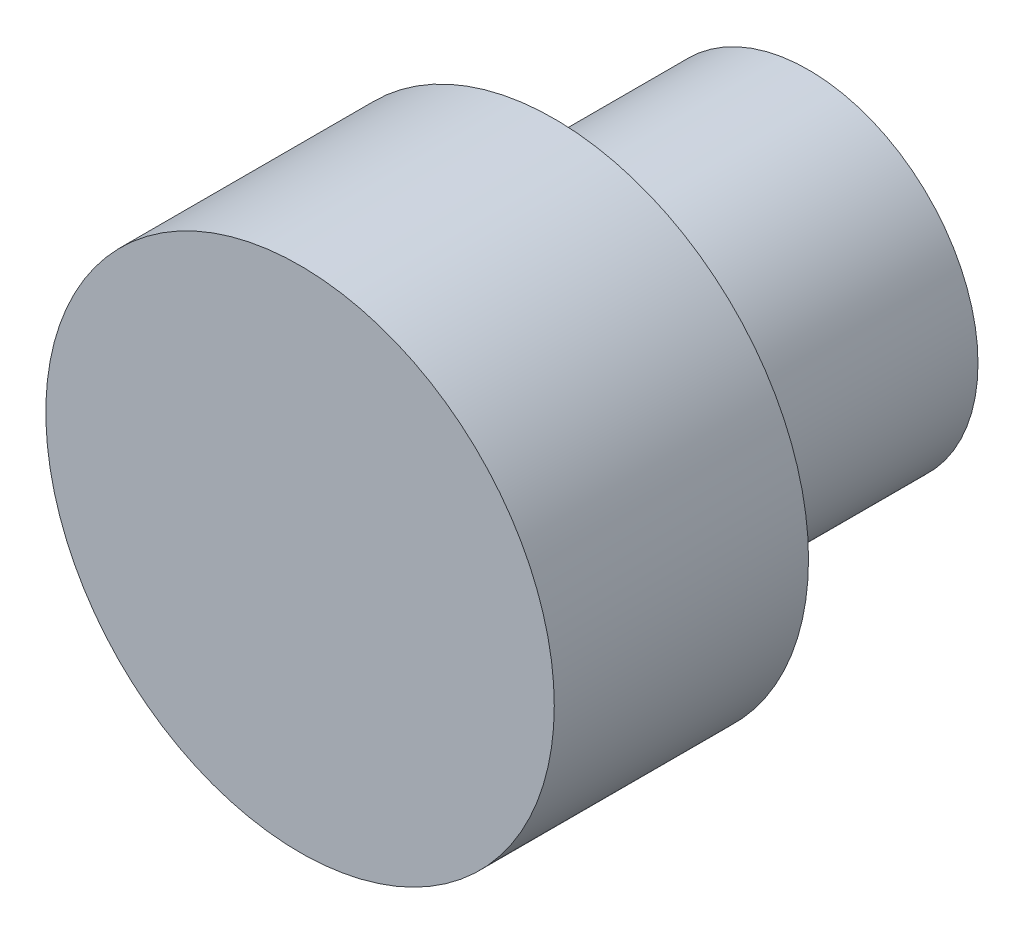
ISO-10303-21;
HEADER;
FILE_DESCRIPTION(('STEP AP214'),'2;1');
FILE_NAME('part.step','',(''),(''),'','','');
FILE_SCHEMA(('AUTOMOTIVE_DESIGN { 1 0 10303 214 1 1 1 1 }'));
ENDSEC;
DATA;
#1=APPLICATION_CONTEXT('core data for automotive mechanical design processes');
#2=APPLICATION_PROTOCOL_DEFINITION('international standard','automotive_design',2000,#1);
#3=PRODUCT_CONTEXT('',#1,'mechanical');
#4=PRODUCT('Part','Part','',(#3));
#5=PRODUCT_RELATED_PRODUCT_CATEGORY('part','',(#4));
#6=PRODUCT_DEFINITION_FORMATION('','',#4);
#7=PRODUCT_DEFINITION_CONTEXT('part definition',#1,'design');
#8=PRODUCT_DEFINITION('design','',#6,#7);
#9=PRODUCT_DEFINITION_SHAPE('','',#8);
#10=(LENGTH_UNIT() NAMED_UNIT(*) SI_UNIT(.MILLI.,.METRE.));
#11=(NAMED_UNIT(*) PLANE_ANGLE_UNIT() SI_UNIT($,.RADIAN.));
#12=(NAMED_UNIT(*) SI_UNIT($,.STERADIAN.) SOLID_ANGLE_UNIT());
#13=UNCERTAINTY_MEASURE_WITH_UNIT(LENGTH_MEASURE(1.E-05),#10,'distance_accuracy_value','');
#14=(GEOMETRIC_REPRESENTATION_CONTEXT(3) GLOBAL_UNCERTAINTY_ASSIGNED_CONTEXT((#13)) GLOBAL_UNIT_ASSIGNED_CONTEXT((#10,
#11,#12)) REPRESENTATION_CONTEXT('',''));
#15=CARTESIAN_POINT('',(0.,0.,0.));
#16=DIRECTION('',(0.,0.,1.));
#17=DIRECTION('',(1.,0.,0.));
#18=AXIS2_PLACEMENT_3D('',#15,#16,#17);
#19=CARTESIAN_POINT('',(0.,3.,0.));
#20=DIRECTION('',(0.,0.,-1.));
#21=DIRECTION('',(-1.,0.,0.));
#22=AXIS2_PLACEMENT_3D('',#19,#20,#21);
#23=PLANE('',#22);
#24=CARTESIAN_POINT('',(0.,0.,0.));
#25=DIRECTION('',(0.,0.,1.));
#26=DIRECTION('',(1.,0.,0.));
#27=AXIS2_PLACEMENT_3D('',#24,#25,#26);
#28=CIRCLE('',#27,3.);
#29=CARTESIAN_POINT('',(3.,0.,0.));
#30=VERTEX_POINT('',#29);
#31=EDGE_CURVE('E46',#30,#30,#28,.T.);
#32=ORIENTED_EDGE('',*,*,#31,.T.);
#33=EDGE_LOOP('',(#32));
#34=FACE_BOUND('',#33,.T.);
#35=ADVANCED_FACE('F32',(#34),#23,.F.);
#36=CARTESIAN_POINT('',(0.,0.,-6.));
#37=DIRECTION('',(0.,0.,1.));
#38=DIRECTION('',(1.,0.,0.));
#39=AXIS2_PLACEMENT_3D('',#36,#37,#38);
#40=PLANE('',#39);
#41=CARTESIAN_POINT('',(0.,0.,-6.));
#42=DIRECTION('',(0.,0.,1.));
#43=DIRECTION('',(1.,0.,0.));
#44=AXIS2_PLACEMENT_3D('',#41,#42,#43);
#45=CIRCLE('',#44,2.);
#46=CARTESIAN_POINT('',(2.,0.,-6.));
#47=VERTEX_POINT('',#46);
#48=EDGE_CURVE('E10',#47,#47,#45,.T.);
#49=ORIENTED_EDGE('',*,*,#48,.F.);
#50=EDGE_LOOP('',(#49));
#51=FACE_BOUND('',#50,.T.);
#52=ADVANCED_FACE('F66',(#51),#40,.F.);
#53=CARTESIAN_POINT('',(0.,0.,0.));
#54=DIRECTION('',(0.,0.,1.));
#55=DIRECTION('',(1.,0.,0.));
#56=AXIS2_PLACEMENT_3D('',#53,#54,#55);
#57=CYLINDRICAL_SURFACE('',#56,2.);
#58=CARTESIAN_POINT('',(0.,0.,-3.));
#59=DIRECTION('',(0.,0.,1.));
#60=DIRECTION('',(1.,0.,0.));
#61=AXIS2_PLACEMENT_3D('',#58,#59,#60);
#62=CIRCLE('',#61,2.);
#63=CARTESIAN_POINT('',(2.,0.,-3.));
#64=VERTEX_POINT('',#63);
#65=EDGE_CURVE('E38',#64,#64,#62,.T.);
#66=ORIENTED_EDGE('',*,*,#65,.F.);
#67=EDGE_LOOP('',(#66));
#68=FACE_BOUND('',#67,.T.);
#69=ORIENTED_EDGE('',*,*,#48,.T.);
#70=EDGE_LOOP('',(#69));
#71=FACE_BOUND('',#70,.T.);
#72=ADVANCED_FACE('F61',(#68,#71),#57,.T.);
#73=CARTESIAN_POINT('',(0.,2.,-3.));
#74=DIRECTION('',(0.,0.,1.));
#75=DIRECTION('',(1.,0.,0.));
#76=AXIS2_PLACEMENT_3D('',#73,#74,#75);
#77=PLANE('',#76);
#78=CARTESIAN_POINT('',(0.,0.,-3.));
#79=DIRECTION('',(0.,0.,1.));
#80=DIRECTION('',(1.,0.,0.));
#81=AXIS2_PLACEMENT_3D('',#78,#79,#80);
#82=CIRCLE('',#81,3.);
#83=CARTESIAN_POINT('',(3.,0.,-3.));
#84=VERTEX_POINT('',#83);
#85=EDGE_CURVE('E42',#84,#84,#82,.T.);
#86=ORIENTED_EDGE('',*,*,#85,.F.);
#87=EDGE_LOOP('',(#86));
#88=FACE_BOUND('',#87,.T.);
#89=ORIENTED_EDGE('',*,*,#65,.T.);
#90=EDGE_LOOP('',(#89));
#91=FACE_BOUND('',#90,.T.);
#92=ADVANCED_FACE('F56',(#88,#91),#77,.F.);
#93=CARTESIAN_POINT('',(0.,0.,0.));
#94=DIRECTION('',(0.,0.,1.));
#95=DIRECTION('',(1.,0.,0.));
#96=AXIS2_PLACEMENT_3D('',#93,#94,#95);
#97=CYLINDRICAL_SURFACE('',#96,3.);
#98=ORIENTED_EDGE('',*,*,#31,.F.);
#99=EDGE_LOOP('',(#98));
#100=FACE_BOUND('',#99,.T.);
#101=ORIENTED_EDGE('',*,*,#85,.T.);
#102=EDGE_LOOP('',(#101));
#103=FACE_BOUND('',#102,.T.);
#104=ADVANCED_FACE('F53',(#100,#103),#97,.T.);
#105=CLOSED_SHELL('',(#35,#52,#72,#92,#104));
#106=MANIFOLD_SOLID_BREP('B2',#105);
#107=ADVANCED_BREP_SHAPE_REPRESENTATION('',(#18,#106),#14);
#108=SHAPE_DEFINITION_REPRESENTATION(#9,#107);
ENDSEC;
END-ISO-10303-21;
